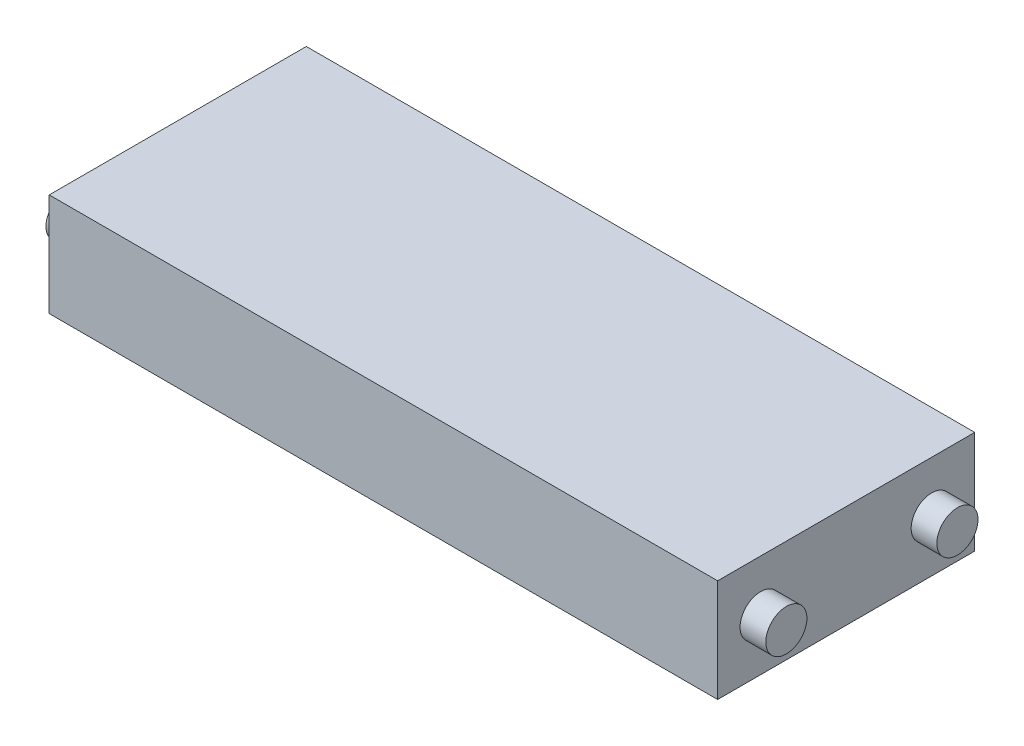
ISO-10303-21;
HEADER;
FILE_DESCRIPTION(('STEP AP214'),'2;1');
FILE_NAME('part.step','',(''),(''),'','','');
FILE_SCHEMA(('AUTOMOTIVE_DESIGN { 1 0 10303 214 1 1 1 1 }'));
ENDSEC;
DATA;
#1=APPLICATION_CONTEXT('core data for automotive mechanical design processes');
#2=APPLICATION_PROTOCOL_DEFINITION('international standard','automotive_design',2000,#1);
#3=PRODUCT_CONTEXT('',#1,'mechanical');
#4=PRODUCT('Part','Part','',(#3));
#5=PRODUCT_RELATED_PRODUCT_CATEGORY('part','',(#4));
#6=PRODUCT_DEFINITION_FORMATION('','',#4);
#7=PRODUCT_DEFINITION_CONTEXT('part definition',#1,'design');
#8=PRODUCT_DEFINITION('design','',#6,#7);
#9=PRODUCT_DEFINITION_SHAPE('','',#8);
#10=(LENGTH_UNIT() NAMED_UNIT(*) SI_UNIT(.MILLI.,.METRE.));
#11=(NAMED_UNIT(*) PLANE_ANGLE_UNIT() SI_UNIT($,.RADIAN.));
#12=(NAMED_UNIT(*) SI_UNIT($,.STERADIAN.) SOLID_ANGLE_UNIT());
#13=UNCERTAINTY_MEASURE_WITH_UNIT(LENGTH_MEASURE(1.E-05),#10,'distance_accuracy_value','');
#14=(GEOMETRIC_REPRESENTATION_CONTEXT(3) GLOBAL_UNCERTAINTY_ASSIGNED_CONTEXT((#13)) GLOBAL_UNIT_ASSIGNED_CONTEXT((#10,
#11,#12)) REPRESENTATION_CONTEXT('',''));
#15=CARTESIAN_POINT('',(0.,0.,0.));
#16=DIRECTION('',(0.,0.,1.));
#17=DIRECTION('',(1.,0.,0.));
#18=AXIS2_PLACEMENT_3D('',#15,#16,#17);
#19=CARTESIAN_POINT('',(-32.5,10.,-12.5));
#20=DIRECTION('',(1.,0.,0.));
#21=DIRECTION('',(0.,0.,-1.));
#22=AXIS2_PLACEMENT_3D('',#19,#20,#21);
#23=PLANE('',#22);
#24=CARTESIAN_POINT('',(-32.5,5.,-8.31907705183095));
#25=DIRECTION('',(1.,0.,0.));
#26=DIRECTION('',(0.,0.,-1.));
#27=AXIS2_PLACEMENT_3D('',#24,#25,#26);
#28=CIRCLE('',#27,2.);
#29=CARTESIAN_POINT('',(-32.5,5.,-10.319077051831));
#30=VERTEX_POINT('',#29);
#31=EDGE_CURVE('E143',#30,#30,#28,.T.);
#32=ORIENTED_EDGE('',*,*,#31,.T.);
#33=EDGE_LOOP('',(#32));
#34=FACE_BOUND('',#33,.T.);
#35=CARTESIAN_POINT('',(-32.5,5.,8.31907705183095));
#36=DIRECTION('',(1.,0.,0.));
#37=DIRECTION('',(0.,0.,-1.));
#38=AXIS2_PLACEMENT_3D('',#35,#36,#37);
#39=CIRCLE('',#38,2.);
#40=CARTESIAN_POINT('',(-32.5,5.,6.31907705183095));
#41=VERTEX_POINT('',#40);
#42=EDGE_CURVE('E116',#41,#41,#39,.T.);
#43=ORIENTED_EDGE('',*,*,#42,.T.);
#44=EDGE_LOOP('',(#43));
#45=FACE_BOUND('',#44,.T.);
#46=DIRECTION('',(0.,0.,1.));
#47=VECTOR('',#46,1.);
#48=CARTESIAN_POINT('',(-32.5,0.,-12.5));
#49=LINE('',#48,#47);
#50=CARTESIAN_POINT('',(-32.5,0.,-12.5));
#51=VERTEX_POINT('',#50);
#52=CARTESIAN_POINT('',(-32.5,0.,12.5));
#53=VERTEX_POINT('',#52);
#54=EDGE_CURVE('E112',#51,#53,#49,.T.);
#55=ORIENTED_EDGE('',*,*,#54,.T.);
#56=DIRECTION('',(0.,-1.,0.));
#57=VECTOR('',#56,1.);
#58=CARTESIAN_POINT('',(-32.5,10.,12.5));
#59=LINE('',#58,#57);
#60=CARTESIAN_POINT('',(-32.5,10.,12.5));
#61=VERTEX_POINT('',#60);
#62=EDGE_CURVE('E12',#61,#53,#59,.T.);
#63=ORIENTED_EDGE('',*,*,#62,.F.);
#64=DIRECTION('',(0.,0.,1.));
#65=VECTOR('',#64,1.);
#66=CARTESIAN_POINT('',(-32.5,10.,-12.5));
#67=LINE('',#66,#65);
#68=CARTESIAN_POINT('',(-32.5,10.,-12.5));
#69=VERTEX_POINT('',#68);
#70=EDGE_CURVE('E95',#69,#61,#67,.T.);
#71=ORIENTED_EDGE('',*,*,#70,.F.);
#72=DIRECTION('',(0.,-1.,0.));
#73=VECTOR('',#72,1.);
#74=CARTESIAN_POINT('',(-32.5,10.,-12.5));
#75=LINE('',#74,#73);
#76=EDGE_CURVE('E108',#69,#51,#75,.T.);
#77=ORIENTED_EDGE('',*,*,#76,.T.);
#78=EDGE_LOOP('',(#55,#63,#71,#77));
#79=FACE_BOUND('',#78,.T.);
#80=ADVANCED_FACE('F41',(#34,#45,#79),#23,.F.);
#81=CARTESIAN_POINT('',(-32.5,10.,12.5));
#82=DIRECTION('',(0.,0.,-1.));
#83=DIRECTION('',(-1.,0.,0.));
#84=AXIS2_PLACEMENT_3D('',#81,#82,#83);
#85=PLANE('',#84);
#86=DIRECTION('',(1.,0.,0.));
#87=VECTOR('',#86,1.);
#88=CARTESIAN_POINT('',(-32.5,0.,12.5));
#89=LINE('',#88,#87);
#90=CARTESIAN_POINT('',(32.5,0.,12.5));
#91=VERTEX_POINT('',#90);
#92=EDGE_CURVE('E100',#53,#91,#89,.T.);
#93=ORIENTED_EDGE('',*,*,#92,.T.);
#94=DIRECTION('',(0.,-1.,0.));
#95=VECTOR('',#94,1.);
#96=CARTESIAN_POINT('',(32.5,10.,12.5));
#97=LINE('',#96,#95);
#98=CARTESIAN_POINT('',(32.5,10.,12.5));
#99=VERTEX_POINT('',#98);
#100=EDGE_CURVE('E51',#99,#91,#97,.T.);
#101=ORIENTED_EDGE('',*,*,#100,.F.);
#102=DIRECTION('',(1.,0.,0.));
#103=VECTOR('',#102,1.);
#104=CARTESIAN_POINT('',(-32.5,10.,12.5));
#105=LINE('',#104,#103);
#106=EDGE_CURVE('E90',#61,#99,#105,.T.);
#107=ORIENTED_EDGE('',*,*,#106,.F.);
#108=ORIENTED_EDGE('',*,*,#62,.T.);
#109=EDGE_LOOP('',(#93,#101,#107,#108));
#110=FACE_BOUND('',#109,.T.);
#111=ADVANCED_FACE('F99',(#110),#85,.F.);
#112=CARTESIAN_POINT('',(32.5,10.,-12.5));
#113=DIRECTION('',(-1.,0.,0.));
#114=DIRECTION('',(0.,0.,1.));
#115=AXIS2_PLACEMENT_3D('',#112,#113,#114);
#116=PLANE('',#115);
#117=CARTESIAN_POINT('',(32.5,5.,-8.31907705183095));
#118=DIRECTION('',(-1.,0.,0.));
#119=DIRECTION('',(0.,0.,1.));
#120=AXIS2_PLACEMENT_3D('',#117,#118,#119);
#121=CIRCLE('',#120,2.);
#122=CARTESIAN_POINT('',(32.5,5.,-6.31907705183095));
#123=VERTEX_POINT('',#122);
#124=EDGE_CURVE('E44',#123,#123,#121,.T.);
#125=ORIENTED_EDGE('',*,*,#124,.T.);
#126=EDGE_LOOP('',(#125));
#127=FACE_BOUND('',#126,.T.);
#128=CARTESIAN_POINT('',(32.5,5.,8.31907705183095));
#129=DIRECTION('',(-1.,0.,0.));
#130=DIRECTION('',(0.,0.,1.));
#131=AXIS2_PLACEMENT_3D('',#128,#129,#130);
#132=CIRCLE('',#131,2.);
#133=CARTESIAN_POINT('',(32.5,5.,10.319077051831));
#134=VERTEX_POINT('',#133);
#135=EDGE_CURVE('E126',#134,#134,#132,.T.);
#136=ORIENTED_EDGE('',*,*,#135,.T.);
#137=EDGE_LOOP('',(#136));
#138=FACE_BOUND('',#137,.T.);
#139=DIRECTION('',(0.,0.,-1.));
#140=VECTOR('',#139,1.);
#141=CARTESIAN_POINT('',(32.5,0.,-12.5));
#142=LINE('',#141,#140);
#143=CARTESIAN_POINT('',(32.5,0.,-12.5));
#144=VERTEX_POINT('',#143);
#145=EDGE_CURVE('E77',#91,#144,#142,.T.);
#146=ORIENTED_EDGE('',*,*,#145,.T.);
#147=DIRECTION('',(0.,-1.,0.));
#148=VECTOR('',#147,1.);
#149=CARTESIAN_POINT('',(32.5,10.,-12.5));
#150=LINE('',#149,#148);
#151=CARTESIAN_POINT('',(32.5,10.,-12.5));
#152=VERTEX_POINT('',#151);
#153=EDGE_CURVE('E102',#152,#144,#150,.T.);
#154=ORIENTED_EDGE('',*,*,#153,.F.);
#155=DIRECTION('',(0.,0.,-1.));
#156=VECTOR('',#155,1.);
#157=CARTESIAN_POINT('',(32.5,10.,-12.5));
#158=LINE('',#157,#156);
#159=EDGE_CURVE('E93',#99,#152,#158,.T.);
#160=ORIENTED_EDGE('',*,*,#159,.F.);
#161=ORIENTED_EDGE('',*,*,#100,.T.);
#162=EDGE_LOOP('',(#146,#154,#160,#161));
#163=FACE_BOUND('',#162,.T.);
#164=ADVANCED_FACE('F104',(#127,#138,#163),#116,.F.);
#165=CARTESIAN_POINT('',(-32.5,10.,-12.5));
#166=DIRECTION('',(0.,0.,1.));
#167=DIRECTION('',(1.,0.,0.));
#168=AXIS2_PLACEMENT_3D('',#165,#166,#167);
#169=PLANE('',#168);
#170=DIRECTION('',(-1.,0.,0.));
#171=VECTOR('',#170,1.);
#172=CARTESIAN_POINT('',(-32.5,0.,-12.5));
#173=LINE('',#172,#171);
#174=EDGE_CURVE('E83',#144,#51,#173,.T.);
#175=ORIENTED_EDGE('',*,*,#174,.T.);
#176=ORIENTED_EDGE('',*,*,#76,.F.);
#177=DIRECTION('',(-1.,0.,0.));
#178=VECTOR('',#177,1.);
#179=CARTESIAN_POINT('',(-32.5,10.,-12.5));
#180=LINE('',#179,#178);
#181=EDGE_CURVE('E60',#152,#69,#180,.T.);
#182=ORIENTED_EDGE('',*,*,#181,.F.);
#183=ORIENTED_EDGE('',*,*,#153,.T.);
#184=EDGE_LOOP('',(#175,#176,#182,#183));
#185=FACE_BOUND('',#184,.T.);
#186=ADVANCED_FACE('F171',(#185),#169,.F.);
#187=CARTESIAN_POINT('',(0.,10.,0.));
#188=DIRECTION('',(0.,1.,0.));
#189=DIRECTION('',(0.,0.,1.));
#190=AXIS2_PLACEMENT_3D('',#187,#188,#189);
#191=PLANE('',#190);
#192=ORIENTED_EDGE('',*,*,#70,.T.);
#193=ORIENTED_EDGE('',*,*,#106,.T.);
#194=ORIENTED_EDGE('',*,*,#159,.T.);
#195=ORIENTED_EDGE('',*,*,#181,.T.);
#196=EDGE_LOOP('',(#192,#193,#194,#195));
#197=FACE_BOUND('',#196,.T.);
#198=ADVANCED_FACE('F91',(#197),#191,.T.);
#199=CARTESIAN_POINT('',(0.,0.,0.));
#200=DIRECTION('',(0.,1.,0.));
#201=DIRECTION('',(0.,0.,1.));
#202=AXIS2_PLACEMENT_3D('',#199,#200,#201);
#203=PLANE('',#202);
#204=ORIENTED_EDGE('',*,*,#54,.F.);
#205=ORIENTED_EDGE('',*,*,#174,.F.);
#206=ORIENTED_EDGE('',*,*,#145,.F.);
#207=ORIENTED_EDGE('',*,*,#92,.F.);
#208=EDGE_LOOP('',(#204,#205,#206,#207));
#209=FACE_BOUND('',#208,.T.);
#210=ADVANCED_FACE('F188',(#209),#203,.F.);
#211=CARTESIAN_POINT('',(35.,5.,8.31907705183095));
#212=DIRECTION('',(1.,0.,0.));
#213=DIRECTION('',(0.,0.,-1.));
#214=AXIS2_PLACEMENT_3D('',#211,#212,#213);
#215=PLANE('',#214);
#216=CARTESIAN_POINT('',(35.,5.,8.31907705183095));
#217=DIRECTION('',(1.,0.,0.));
#218=DIRECTION('',(0.,0.,-1.));
#219=AXIS2_PLACEMENT_3D('',#216,#217,#218);
#220=CIRCLE('',#219,2.);
#221=CARTESIAN_POINT('',(35.,5.,6.31907705183095));
#222=VERTEX_POINT('',#221);
#223=EDGE_CURVE('E137',#222,#222,#220,.T.);
#224=ORIENTED_EDGE('',*,*,#223,.T.);
#225=EDGE_LOOP('',(#224));
#226=FACE_BOUND('',#225,.T.);
#227=ADVANCED_FACE('F190',(#226),#215,.T.);
#228=CARTESIAN_POINT('',(-43.1568542494924,5.,8.31907705183095));
#229=DIRECTION('',(1.,0.,0.));
#230=DIRECTION('',(0.,0.,-1.));
#231=AXIS2_PLACEMENT_3D('',#228,#229,#230);
#232=CYLINDRICAL_SURFACE('',#231,2.);
#233=ORIENTED_EDGE('',*,*,#223,.F.);
#234=EDGE_LOOP('',(#233));
#235=FACE_BOUND('',#234,.T.);
#236=ORIENTED_EDGE('',*,*,#135,.F.);
#237=EDGE_LOOP('',(#236));
#238=FACE_BOUND('',#237,.T.);
#239=ADVANCED_FACE('F196',(#235,#238),#232,.T.);
#240=CARTESIAN_POINT('',(-35.,5.,8.31907705183095));
#241=DIRECTION('',(1.,0.,0.));
#242=DIRECTION('',(0.,0.,-1.));
#243=AXIS2_PLACEMENT_3D('',#240,#241,#242);
#244=CIRCLE('',#243,2.);
#245=CARTESIAN_POINT('',(-35.,5.,6.31907705183095));
#246=VERTEX_POINT('',#245);
#247=EDGE_CURVE('E129',#246,#246,#244,.F.);
#248=ORIENTED_EDGE('',*,*,#247,.F.);
#249=EDGE_LOOP('',(#248));
#250=FACE_BOUND('',#249,.T.);
#251=ORIENTED_EDGE('',*,*,#42,.F.);
#252=EDGE_LOOP('',(#251));
#253=FACE_BOUND('',#252,.T.);
#254=ADVANCED_FACE('F201',(#250,#253),#232,.T.);
#255=CARTESIAN_POINT('',(-35.,10.,-12.5));
#256=DIRECTION('',(1.,0.,0.));
#257=DIRECTION('',(0.,0.,-1.));
#258=AXIS2_PLACEMENT_3D('',#255,#256,#257);
#259=PLANE('',#258);
#260=ORIENTED_EDGE('',*,*,#247,.T.);
#261=EDGE_LOOP('',(#260));
#262=FACE_BOUND('',#261,.T.);
#263=ADVANCED_FACE('F204',(#262),#259,.F.);
#264=CARTESIAN_POINT('',(35.,5.,-8.31907705183095));
#265=DIRECTION('',(1.,0.,0.));
#266=DIRECTION('',(0.,0.,-1.));
#267=AXIS2_PLACEMENT_3D('',#264,#265,#266);
#268=PLANE('',#267);
#269=CARTESIAN_POINT('',(35.,5.,-8.31907705183095));
#270=DIRECTION('',(1.,0.,0.));
#271=DIRECTION('',(0.,0.,-1.));
#272=AXIS2_PLACEMENT_3D('',#269,#270,#271);
#273=CIRCLE('',#272,2.);
#274=CARTESIAN_POINT('',(35.,5.,-10.319077051831));
#275=VERTEX_POINT('',#274);
#276=EDGE_CURVE('E154',#275,#275,#273,.T.);
#277=ORIENTED_EDGE('',*,*,#276,.T.);
#278=EDGE_LOOP('',(#277));
#279=FACE_BOUND('',#278,.T.);
#280=ADVANCED_FACE('F159',(#279),#268,.T.);
#281=CARTESIAN_POINT('',(-43.1568542494924,5.,-8.31907705183095));
#282=DIRECTION('',(1.,0.,0.));
#283=DIRECTION('',(0.,0.,-1.));
#284=AXIS2_PLACEMENT_3D('',#281,#282,#283);
#285=CYLINDRICAL_SURFACE('',#284,2.);
#286=ORIENTED_EDGE('',*,*,#276,.F.);
#287=EDGE_LOOP('',(#286));
#288=FACE_BOUND('',#287,.T.);
#289=ORIENTED_EDGE('',*,*,#124,.F.);
#290=EDGE_LOOP('',(#289));
#291=FACE_BOUND('',#290,.T.);
#292=ADVANCED_FACE('F161',(#288,#291),#285,.T.);
#293=CARTESIAN_POINT('',(-35.,5.,-8.31907705183095));
#294=DIRECTION('',(1.,0.,0.));
#295=DIRECTION('',(0.,0.,-1.));
#296=AXIS2_PLACEMENT_3D('',#293,#294,#295);
#297=CIRCLE('',#296,2.);
#298=CARTESIAN_POINT('',(-35.,5.,-10.319077051831));
#299=VERTEX_POINT('',#298);
#300=EDGE_CURVE('E150',#299,#299,#297,.F.);
#301=ORIENTED_EDGE('',*,*,#300,.F.);
#302=EDGE_LOOP('',(#301));
#303=FACE_BOUND('',#302,.T.);
#304=ORIENTED_EDGE('',*,*,#31,.F.);
#305=EDGE_LOOP('',(#304));
#306=FACE_BOUND('',#305,.T.);
#307=ADVANCED_FACE('F164',(#303,#306),#285,.T.);
#308=CARTESIAN_POINT('',(-35.,10.,-12.5));
#309=DIRECTION('',(1.,0.,0.));
#310=DIRECTION('',(0.,0.,-1.));
#311=AXIS2_PLACEMENT_3D('',#308,#309,#310);
#312=PLANE('',#311);
#313=ORIENTED_EDGE('',*,*,#300,.T.);
#314=EDGE_LOOP('',(#313));
#315=FACE_BOUND('',#314,.T.);
#316=ADVANCED_FACE('F209',(#315),#312,.F.);
#317=CLOSED_SHELL('',(#80,#111,#164,#186,#198,#210,#227,#239,#254,#263,#280,#292,#307,#316));
#318=MANIFOLD_SOLID_BREP('B2',#317);
#319=ADVANCED_BREP_SHAPE_REPRESENTATION('',(#18,#318),#14);
#320=SHAPE_DEFINITION_REPRESENTATION(#9,#319);
ENDSEC;
END-ISO-10303-21;
